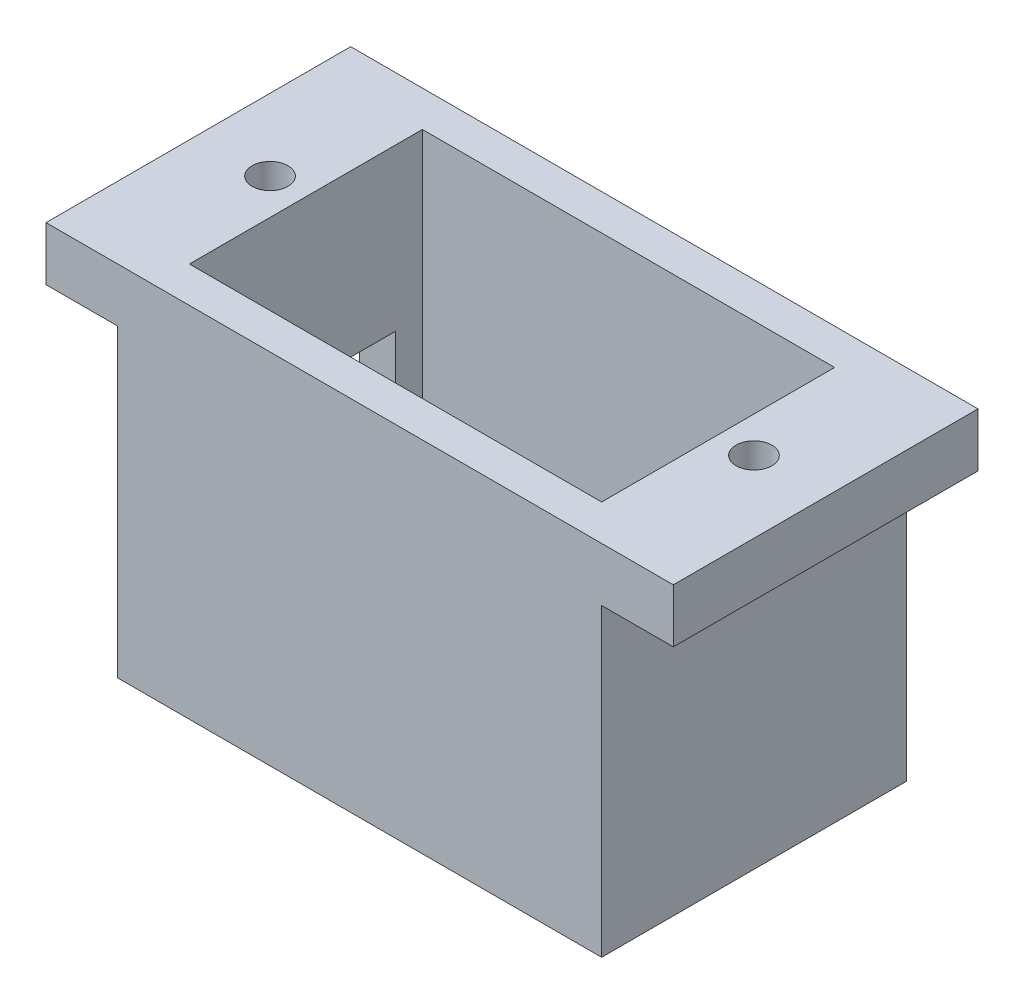
ISO-10303-21;
HEADER;
FILE_DESCRIPTION(('STEP AP214'),'2;1');
FILE_NAME('part.step','',(''),(''),'','','');
FILE_SCHEMA(('AUTOMOTIVE_DESIGN { 1 0 10303 214 1 1 1 1 }'));
ENDSEC;
DATA;
#1=APPLICATION_CONTEXT('core data for automotive mechanical design processes');
#2=APPLICATION_PROTOCOL_DEFINITION('international standard','automotive_design',2000,#1);
#3=PRODUCT_CONTEXT('',#1,'mechanical');
#4=PRODUCT('Part','Part','',(#3));
#5=PRODUCT_RELATED_PRODUCT_CATEGORY('part','',(#4));
#6=PRODUCT_DEFINITION_FORMATION('','',#4);
#7=PRODUCT_DEFINITION_CONTEXT('part definition',#1,'design');
#8=PRODUCT_DEFINITION('design','',#6,#7);
#9=PRODUCT_DEFINITION_SHAPE('','',#8);
#10=(LENGTH_UNIT() NAMED_UNIT(*) SI_UNIT(.MILLI.,.METRE.));
#11=(NAMED_UNIT(*) PLANE_ANGLE_UNIT() SI_UNIT($,.RADIAN.));
#12=(NAMED_UNIT(*) SI_UNIT($,.STERADIAN.) SOLID_ANGLE_UNIT());
#13=UNCERTAINTY_MEASURE_WITH_UNIT(LENGTH_MEASURE(1.E-05),#10,'distance_accuracy_value','');
#14=(GEOMETRIC_REPRESENTATION_CONTEXT(3) GLOBAL_UNCERTAINTY_ASSIGNED_CONTEXT((#13)) GLOBAL_UNIT_ASSIGNED_CONTEXT((#10,
#11,#12)) REPRESENTATION_CONTEXT('',''));
#15=CARTESIAN_POINT('',(0.,0.,0.));
#16=DIRECTION('',(0.,0.,1.));
#17=DIRECTION('',(1.,0.,0.));
#18=AXIS2_PLACEMENT_3D('',#15,#16,#17);
#19=CARTESIAN_POINT('',(0.,18.,0.));
#20=DIRECTION('',(0.,-1.,0.));
#21=DIRECTION('',(0.,0.,-1.));
#22=AXIS2_PLACEMENT_3D('',#19,#20,#21);
#23=PLANE('',#22);
#24=CARTESIAN_POINT('',(-13.5,18.,0.));
#25=DIRECTION('',(0.,1.,0.));
#26=DIRECTION('',(0.,0.,1.));
#27=AXIS2_PLACEMENT_3D('',#24,#25,#26);
#28=CIRCLE('',#27,1.);
#29=CARTESIAN_POINT('',(-13.5,18.,0.999999999999996));
#30=VERTEX_POINT('',#29);
#31=EDGE_CURVE('E177',#30,#30,#28,.T.);
#32=ORIENTED_EDGE('',*,*,#31,.F.);
#33=EDGE_LOOP('',(#32));
#34=FACE_BOUND('',#33,.T.);
#35=CARTESIAN_POINT('',(13.5,18.,0.));
#36=DIRECTION('',(0.,1.,0.));
#37=DIRECTION('',(0.,0.,1.));
#38=AXIS2_PLACEMENT_3D('',#35,#36,#37);
#39=CIRCLE('',#38,1.);
#40=CARTESIAN_POINT('',(13.5,18.,0.999999999999996));
#41=VERTEX_POINT('',#40);
#42=EDGE_CURVE('E187',#41,#41,#39,.T.);
#43=ORIENTED_EDGE('',*,*,#42,.F.);
#44=EDGE_LOOP('',(#43));
#45=FACE_BOUND('',#44,.T.);
#46=DIRECTION('',(-1.,0.,0.));
#47=VECTOR('',#46,1.);
#48=CARTESIAN_POINT('',(-13.5,18.,-8.5));
#49=LINE('',#48,#47);
#50=CARTESIAN_POINT('',(17.5,18.,-8.5));
#51=VERTEX_POINT('',#50);
#52=CARTESIAN_POINT('',(-17.5,18.,-8.5));
#53=VERTEX_POINT('',#52);
#54=EDGE_CURVE('E316',#51,#53,#49,.T.);
#55=ORIENTED_EDGE('',*,*,#54,.T.);
#56=DIRECTION('',(0.,0.,1.));
#57=VECTOR('',#56,1.);
#58=CARTESIAN_POINT('',(-17.5,18.,-8.5));
#59=LINE('',#58,#57);
#60=CARTESIAN_POINT('',(-17.5,18.,8.5));
#61=VERTEX_POINT('',#60);
#62=EDGE_CURVE('E194',#53,#61,#59,.T.);
#63=ORIENTED_EDGE('',*,*,#62,.T.);
#64=DIRECTION('',(1.,0.,0.));
#65=VECTOR('',#64,1.);
#66=CARTESIAN_POINT('',(-13.5,18.,8.5));
#67=LINE('',#66,#65);
#68=CARTESIAN_POINT('',(17.5,18.,8.5));
#69=VERTEX_POINT('',#68);
#70=EDGE_CURVE('E318',#61,#69,#67,.T.);
#71=ORIENTED_EDGE('',*,*,#70,.T.);
#72=DIRECTION('',(0.,0.,-1.));
#73=VECTOR('',#72,1.);
#74=CARTESIAN_POINT('',(17.5,18.,8.5));
#75=LINE('',#74,#73);
#76=EDGE_CURVE('E211',#69,#51,#75,.T.);
#77=ORIENTED_EDGE('',*,*,#76,.T.);
#78=EDGE_LOOP('',(#55,#63,#71,#77));
#79=FACE_BOUND('',#78,.T.);
#80=DIRECTION('',(0.,0.,-1.));
#81=VECTOR('',#80,1.);
#82=CARTESIAN_POINT('',(11.5,18.,-6.5));
#83=LINE('',#82,#81);
#84=CARTESIAN_POINT('',(11.5,18.,6.5));
#85=VERTEX_POINT('',#84);
#86=CARTESIAN_POINT('',(11.5,18.,-6.5));
#87=VERTEX_POINT('',#86);
#88=EDGE_CURVE('E285',#85,#87,#83,.T.);
#89=ORIENTED_EDGE('',*,*,#88,.F.);
#90=DIRECTION('',(1.,0.,0.));
#91=VECTOR('',#90,1.);
#92=CARTESIAN_POINT('',(-11.5,18.,6.5));
#93=LINE('',#92,#91);
#94=CARTESIAN_POINT('',(-11.5,18.,6.5));
#95=VERTEX_POINT('',#94);
#96=EDGE_CURVE('E293',#95,#85,#93,.T.);
#97=ORIENTED_EDGE('',*,*,#96,.F.);
#98=DIRECTION('',(0.,0.,1.));
#99=VECTOR('',#98,1.);
#100=CARTESIAN_POINT('',(-11.5,18.,-6.5));
#101=LINE('',#100,#99);
#102=CARTESIAN_POINT('',(-11.5,18.,-6.5));
#103=VERTEX_POINT('',#102);
#104=EDGE_CURVE('E290',#103,#95,#101,.T.);
#105=ORIENTED_EDGE('',*,*,#104,.F.);
#106=DIRECTION('',(-1.,0.,0.));
#107=VECTOR('',#106,1.);
#108=CARTESIAN_POINT('',(-11.5,18.,-6.5));
#109=LINE('',#108,#107);
#110=EDGE_CURVE('E287',#87,#103,#109,.T.);
#111=ORIENTED_EDGE('',*,*,#110,.F.);
#112=EDGE_LOOP('',(#89,#97,#105,#111));
#113=FACE_BOUND('',#112,.T.);
#114=ADVANCED_FACE('F33',(#34,#45,#79,#113),#23,.F.);
#115=CARTESIAN_POINT('',(-13.5,18.,-8.5));
#116=DIRECTION('',(0.,0.,1.));
#117=DIRECTION('',(1.,0.,0.));
#118=AXIS2_PLACEMENT_3D('',#115,#116,#117);
#119=PLANE('',#118);
#120=ORIENTED_EDGE('',*,*,#54,.F.);
#121=DIRECTION('',(0.,1.,0.));
#122=VECTOR('',#121,1.);
#123=CARTESIAN_POINT('',(17.5,15.,-8.5));
#124=LINE('',#123,#122);
#125=CARTESIAN_POINT('',(17.5,15.,-8.5));
#126=VERTEX_POINT('',#125);
#127=EDGE_CURVE('E229',#126,#51,#124,.T.);
#128=ORIENTED_EDGE('',*,*,#127,.F.);
#129=DIRECTION('',(-1.,0.,0.));
#130=VECTOR('',#129,1.);
#131=CARTESIAN_POINT('',(17.5,15.,-8.5));
#132=LINE('',#131,#130);
#133=CARTESIAN_POINT('',(13.5,15.,-8.5));
#134=VERTEX_POINT('',#133);
#135=EDGE_CURVE('E220',#126,#134,#132,.T.);
#136=ORIENTED_EDGE('',*,*,#135,.T.);
#137=DIRECTION('',(0.,-1.,0.));
#138=VECTOR('',#137,1.);
#139=CARTESIAN_POINT('',(13.5,18.,-8.5));
#140=LINE('',#139,#138);
#141=CARTESIAN_POINT('',(13.5,-2.,-8.5));
#142=VERTEX_POINT('',#141);
#143=EDGE_CURVE('E320',#134,#142,#140,.T.);
#144=ORIENTED_EDGE('',*,*,#143,.T.);
#145=DIRECTION('',(1.,0.,0.));
#146=VECTOR('',#145,1.);
#147=CARTESIAN_POINT('',(0.,-2.,-8.5));
#148=LINE('',#147,#146);
#149=CARTESIAN_POINT('',(-13.5,-2.,-8.5));
#150=VERTEX_POINT('',#149);
#151=EDGE_CURVE('E258',#150,#142,#148,.T.);
#152=ORIENTED_EDGE('',*,*,#151,.F.);
#153=DIRECTION('',(0.,-1.,0.));
#154=VECTOR('',#153,1.);
#155=CARTESIAN_POINT('',(-13.5,18.,-8.5));
#156=LINE('',#155,#154);
#157=CARTESIAN_POINT('',(-13.5,15.,-8.5));
#158=VERTEX_POINT('',#157);
#159=EDGE_CURVE('E326',#158,#150,#156,.T.);
#160=ORIENTED_EDGE('',*,*,#159,.F.);
#161=DIRECTION('',(-1.,0.,0.));
#162=VECTOR('',#161,1.);
#163=CARTESIAN_POINT('',(-13.5,15.,-8.5));
#164=LINE('',#163,#162);
#165=CARTESIAN_POINT('',(-17.5,15.,-8.5));
#166=VERTEX_POINT('',#165);
#167=EDGE_CURVE('E195',#158,#166,#164,.T.);
#168=ORIENTED_EDGE('',*,*,#167,.T.);
#169=DIRECTION('',(0.,1.,0.));
#170=VECTOR('',#169,1.);
#171=CARTESIAN_POINT('',(-17.5,15.,-8.5));
#172=LINE('',#171,#170);
#173=EDGE_CURVE('E205',#166,#53,#172,.T.);
#174=ORIENTED_EDGE('',*,*,#173,.T.);
#175=EDGE_LOOP('',(#120,#128,#136,#144,#152,#160,#168,#174));
#176=FACE_BOUND('',#175,.T.);
#177=ADVANCED_FACE('F35',(#176),#119,.F.);
#178=CARTESIAN_POINT('',(-13.5,18.,-8.5));
#179=DIRECTION('',(1.,0.,0.));
#180=DIRECTION('',(0.,0.,-1.));
#181=AXIS2_PLACEMENT_3D('',#178,#179,#180);
#182=PLANE('',#181);
#183=DIRECTION('',(0.,0.,-1.));
#184=VECTOR('',#183,1.);
#185=CARTESIAN_POINT('',(-13.5,9.,-5.));
#186=LINE('',#185,#184);
#187=CARTESIAN_POINT('',(-13.5,9.,5.));
#188=VERTEX_POINT('',#187);
#189=CARTESIAN_POINT('',(-13.5,9.,-5.));
#190=VERTEX_POINT('',#189);
#191=EDGE_CURVE('E236',#188,#190,#186,.T.);
#192=ORIENTED_EDGE('',*,*,#191,.F.);
#193=DIRECTION('',(0.,1.,0.));
#194=VECTOR('',#193,1.);
#195=CARTESIAN_POINT('',(-13.5,4.,5.));
#196=LINE('',#195,#194);
#197=CARTESIAN_POINT('',(-13.5,4.,5.));
#198=VERTEX_POINT('',#197);
#199=EDGE_CURVE('E232',#198,#188,#196,.T.);
#200=ORIENTED_EDGE('',*,*,#199,.F.);
#201=DIRECTION('',(0.,0.,1.));
#202=VECTOR('',#201,1.);
#203=CARTESIAN_POINT('',(-13.5,4.,-5.));
#204=LINE('',#203,#202);
#205=CARTESIAN_POINT('',(-13.5,4.,-5.));
#206=VERTEX_POINT('',#205);
#207=EDGE_CURVE('E242',#206,#198,#204,.T.);
#208=ORIENTED_EDGE('',*,*,#207,.F.);
#209=DIRECTION('',(0.,-1.,0.));
#210=VECTOR('',#209,1.);
#211=CARTESIAN_POINT('',(-13.5,4.,-5.));
#212=LINE('',#211,#210);
#213=EDGE_CURVE('E239',#190,#206,#212,.T.);
#214=ORIENTED_EDGE('',*,*,#213,.F.);
#215=EDGE_LOOP('',(#192,#200,#208,#214));
#216=FACE_BOUND('',#215,.T.);
#217=DIRECTION('',(0.,0.,1.));
#218=VECTOR('',#217,1.);
#219=CARTESIAN_POINT('',(-13.5,13.,-8.5));
#220=LINE('',#219,#218);
#221=CARTESIAN_POINT('',(-13.5,13.,-1.));
#222=VERTEX_POINT('',#221);
#223=CARTESIAN_POINT('',(-13.5,13.,0.999999999999996));
#224=VERTEX_POINT('',#223);
#225=EDGE_CURVE('E11',#222,#224,#220,.T.);
#226=ORIENTED_EDGE('',*,*,#225,.F.);
#227=DIRECTION('',(0.,1.,0.));
#228=VECTOR('',#227,1.);
#229=CARTESIAN_POINT('',(-13.5,13.,-1.));
#230=LINE('',#229,#228);
#231=CARTESIAN_POINT('',(-13.5,15.,-1.));
#232=VERTEX_POINT('',#231);
#233=EDGE_CURVE('E176',#222,#232,#230,.T.);
#234=ORIENTED_EDGE('',*,*,#233,.T.);
#235=DIRECTION('',(0.,0.,-1.));
#236=VECTOR('',#235,1.);
#237=CARTESIAN_POINT('',(-13.5,15.,-8.5));
#238=LINE('',#237,#236);
#239=EDGE_CURVE('E203',#232,#158,#238,.T.);
#240=ORIENTED_EDGE('',*,*,#239,.T.);
#241=ORIENTED_EDGE('',*,*,#159,.T.);
#242=DIRECTION('',(0.,0.,1.));
#243=VECTOR('',#242,1.);
#244=CARTESIAN_POINT('',(-13.5,-2.,0.));
#245=LINE('',#244,#243);
#246=CARTESIAN_POINT('',(-13.5,-2.,8.5));
#247=VERTEX_POINT('',#246);
#248=EDGE_CURVE('E275',#150,#247,#245,.T.);
#249=ORIENTED_EDGE('',*,*,#248,.T.);
#250=DIRECTION('',(0.,-1.,0.));
#251=VECTOR('',#250,1.);
#252=CARTESIAN_POINT('',(-13.5,18.,8.5));
#253=LINE('',#252,#251);
#254=CARTESIAN_POINT('',(-13.5,15.,8.5));
#255=VERTEX_POINT('',#254);
#256=EDGE_CURVE('E324',#255,#247,#253,.T.);
#257=ORIENTED_EDGE('',*,*,#256,.F.);
#258=CARTESIAN_POINT('',(-13.5,15.,0.999999999999996));
#259=VERTEX_POINT('',#258);
#260=EDGE_CURVE('E183',#255,#259,#238,.T.);
#261=ORIENTED_EDGE('',*,*,#260,.T.);
#262=DIRECTION('',(0.,1.,0.));
#263=VECTOR('',#262,1.);
#264=CARTESIAN_POINT('',(-13.5,13.,0.999999999999996));
#265=LINE('',#264,#263);
#266=EDGE_CURVE('E56',#259,#224,#265,.F.);
#267=ORIENTED_EDGE('',*,*,#266,.T.);
#268=EDGE_LOOP('',(#226,#234,#240,#241,#249,#257,#261,#267));
#269=FACE_BOUND('',#268,.T.);
#270=ADVANCED_FACE('F180',(#216,#269),#182,.F.);
#271=CARTESIAN_POINT('',(-13.5,18.,8.5));
#272=DIRECTION('',(0.,0.,-1.));
#273=DIRECTION('',(-1.,0.,0.));
#274=AXIS2_PLACEMENT_3D('',#271,#272,#273);
#275=PLANE('',#274);
#276=ORIENTED_EDGE('',*,*,#70,.F.);
#277=DIRECTION('',(0.,1.,0.));
#278=VECTOR('',#277,1.);
#279=CARTESIAN_POINT('',(-17.5,15.,8.5));
#280=LINE('',#279,#278);
#281=CARTESIAN_POINT('',(-17.5,15.,8.5));
#282=VERTEX_POINT('',#281);
#283=EDGE_CURVE('E208',#282,#61,#280,.T.);
#284=ORIENTED_EDGE('',*,*,#283,.F.);
#285=DIRECTION('',(1.,0.,0.));
#286=VECTOR('',#285,1.);
#287=CARTESIAN_POINT('',(-17.5,15.,8.5));
#288=LINE('',#287,#286);
#289=EDGE_CURVE('E201',#282,#255,#288,.T.);
#290=ORIENTED_EDGE('',*,*,#289,.T.);
#291=ORIENTED_EDGE('',*,*,#256,.T.);
#292=DIRECTION('',(1.,0.,0.));
#293=VECTOR('',#292,1.);
#294=CARTESIAN_POINT('',(0.,-2.,8.5));
#295=LINE('',#294,#293);
#296=CARTESIAN_POINT('',(13.5,-2.,8.5));
#297=VERTEX_POINT('',#296);
#298=EDGE_CURVE('E278',#247,#297,#295,.T.);
#299=ORIENTED_EDGE('',*,*,#298,.T.);
#300=DIRECTION('',(0.,-1.,0.));
#301=VECTOR('',#300,1.);
#302=CARTESIAN_POINT('',(13.5,18.,8.5));
#303=LINE('',#302,#301);
#304=CARTESIAN_POINT('',(13.5,15.,8.5));
#305=VERTEX_POINT('',#304);
#306=EDGE_CURVE('E322',#305,#297,#303,.T.);
#307=ORIENTED_EDGE('',*,*,#306,.F.);
#308=DIRECTION('',(1.,0.,0.));
#309=VECTOR('',#308,1.);
#310=CARTESIAN_POINT('',(13.5,15.,8.5));
#311=LINE('',#310,#309);
#312=CARTESIAN_POINT('',(17.5,15.,8.5));
#313=VERTEX_POINT('',#312);
#314=EDGE_CURVE('E214',#305,#313,#311,.T.);
#315=ORIENTED_EDGE('',*,*,#314,.T.);
#316=DIRECTION('',(0.,1.,0.));
#317=VECTOR('',#316,1.);
#318=CARTESIAN_POINT('',(17.5,15.,8.5));
#319=LINE('',#318,#317);
#320=EDGE_CURVE('E226',#313,#69,#319,.T.);
#321=ORIENTED_EDGE('',*,*,#320,.T.);
#322=EDGE_LOOP('',(#276,#284,#290,#291,#299,#307,#315,#321));
#323=FACE_BOUND('',#322,.T.);
#324=ADVANCED_FACE('F359',(#323),#275,.F.);
#325=CARTESIAN_POINT('',(13.5,18.,-8.5));
#326=DIRECTION('',(-1.,0.,0.));
#327=DIRECTION('',(0.,0.,1.));
#328=AXIS2_PLACEMENT_3D('',#325,#326,#327);
#329=PLANE('',#328);
#330=DIRECTION('',(0.,0.,-1.));
#331=VECTOR('',#330,1.);
#332=CARTESIAN_POINT('',(13.5,13.,-8.5));
#333=LINE('',#332,#331);
#334=CARTESIAN_POINT('',(13.5,13.,0.999999999999996));
#335=VERTEX_POINT('',#334);
#336=CARTESIAN_POINT('',(13.5,13.,-1.));
#337=VERTEX_POINT('',#336);
#338=EDGE_CURVE('E41',#335,#337,#333,.T.);
#339=ORIENTED_EDGE('',*,*,#338,.F.);
#340=DIRECTION('',(0.,1.,0.));
#341=VECTOR('',#340,1.);
#342=CARTESIAN_POINT('',(13.5,13.,0.999999999999996));
#343=LINE('',#342,#341);
#344=CARTESIAN_POINT('',(13.5,15.,0.999999999999996));
#345=VERTEX_POINT('',#344);
#346=EDGE_CURVE('E191',#335,#345,#343,.T.);
#347=ORIENTED_EDGE('',*,*,#346,.T.);
#348=DIRECTION('',(0.,0.,1.));
#349=VECTOR('',#348,1.);
#350=CARTESIAN_POINT('',(13.5,15.,8.5));
#351=LINE('',#350,#349);
#352=EDGE_CURVE('E222',#345,#305,#351,.T.);
#353=ORIENTED_EDGE('',*,*,#352,.T.);
#354=ORIENTED_EDGE('',*,*,#306,.T.);
#355=DIRECTION('',(0.,0.,1.));
#356=VECTOR('',#355,1.);
#357=CARTESIAN_POINT('',(13.5,-2.,0.));
#358=LINE('',#357,#356);
#359=EDGE_CURVE('E281',#142,#297,#358,.T.);
#360=ORIENTED_EDGE('',*,*,#359,.F.);
#361=ORIENTED_EDGE('',*,*,#143,.F.);
#362=CARTESIAN_POINT('',(13.5,15.,-1.));
#363=VERTEX_POINT('',#362);
#364=EDGE_CURVE('E223',#134,#363,#351,.T.);
#365=ORIENTED_EDGE('',*,*,#364,.T.);
#366=DIRECTION('',(0.,1.,0.));
#367=VECTOR('',#366,1.);
#368=CARTESIAN_POINT('',(13.5,13.,-1.));
#369=LINE('',#368,#367);
#370=EDGE_CURVE('E48',#363,#337,#369,.F.);
#371=ORIENTED_EDGE('',*,*,#370,.T.);
#372=EDGE_LOOP('',(#339,#347,#353,#354,#360,#361,#365,#371));
#373=FACE_BOUND('',#372,.T.);
#374=ADVANCED_FACE('F347',(#373),#329,.F.);
#375=CARTESIAN_POINT('',(11.5,18.,-6.5));
#376=DIRECTION('',(-1.,0.,0.));
#377=DIRECTION('',(0.,0.,1.));
#378=AXIS2_PLACEMENT_3D('',#375,#376,#377);
#379=PLANE('',#378);
#380=DIRECTION('',(0.,0.,-1.));
#381=VECTOR('',#380,1.);
#382=CARTESIAN_POINT('',(11.5,0.,-6.5));
#383=LINE('',#382,#381);
#384=CARTESIAN_POINT('',(11.5,0.,6.5));
#385=VERTEX_POINT('',#384);
#386=CARTESIAN_POINT('',(11.5,0.,-6.5));
#387=VERTEX_POINT('',#386);
#388=EDGE_CURVE('E284',#385,#387,#383,.T.);
#389=ORIENTED_EDGE('',*,*,#388,.F.);
#390=DIRECTION('',(0.,-1.,0.));
#391=VECTOR('',#390,1.);
#392=CARTESIAN_POINT('',(11.5,18.,6.5));
#393=LINE('',#392,#391);
#394=EDGE_CURVE('E295',#85,#385,#393,.T.);
#395=ORIENTED_EDGE('',*,*,#394,.F.);
#396=ORIENTED_EDGE('',*,*,#88,.T.);
#397=DIRECTION('',(0.,-1.,0.));
#398=VECTOR('',#397,1.);
#399=CARTESIAN_POINT('',(11.5,18.,-6.5));
#400=LINE('',#399,#398);
#401=EDGE_CURVE('E313',#87,#387,#400,.T.);
#402=ORIENTED_EDGE('',*,*,#401,.T.);
#403=EDGE_LOOP('',(#389,#395,#396,#402));
#404=FACE_BOUND('',#403,.T.);
#405=ADVANCED_FACE('F401',(#404),#379,.T.);
#406=CARTESIAN_POINT('',(-11.5,18.,-6.5));
#407=DIRECTION('',(0.,0.,1.));
#408=DIRECTION('',(1.,0.,0.));
#409=AXIS2_PLACEMENT_3D('',#406,#407,#408);
#410=PLANE('',#409);
#411=DIRECTION('',(-1.,0.,0.));
#412=VECTOR('',#411,1.);
#413=CARTESIAN_POINT('',(-11.5,0.,-6.5));
#414=LINE('',#413,#412);
#415=CARTESIAN_POINT('',(-11.5,0.,-6.5));
#416=VERTEX_POINT('',#415);
#417=EDGE_CURVE('E298',#387,#416,#414,.T.);
#418=ORIENTED_EDGE('',*,*,#417,.F.);
#419=ORIENTED_EDGE('',*,*,#401,.F.);
#420=ORIENTED_EDGE('',*,*,#110,.T.);
#421=DIRECTION('',(0.,-1.,0.));
#422=VECTOR('',#421,1.);
#423=CARTESIAN_POINT('',(-11.5,18.,-6.5));
#424=LINE('',#423,#422);
#425=EDGE_CURVE('E311',#103,#416,#424,.T.);
#426=ORIENTED_EDGE('',*,*,#425,.T.);
#427=EDGE_LOOP('',(#418,#419,#420,#426));
#428=FACE_BOUND('',#427,.T.);
#429=ADVANCED_FACE('F467',(#428),#410,.T.);
#430=CARTESIAN_POINT('',(-11.5,18.,-6.5));
#431=DIRECTION('',(1.,0.,0.));
#432=DIRECTION('',(0.,0.,-1.));
#433=AXIS2_PLACEMENT_3D('',#430,#431,#432);
#434=PLANE('',#433);
#435=DIRECTION('',(0.,-1.,0.));
#436=VECTOR('',#435,1.);
#437=CARTESIAN_POINT('',(-11.5,18.,5.));
#438=LINE('',#437,#436);
#439=CARTESIAN_POINT('',(-11.5,9.,5.));
#440=VERTEX_POINT('',#439);
#441=CARTESIAN_POINT('',(-11.5,4.,5.));
#442=VERTEX_POINT('',#441);
#443=EDGE_CURVE('E335',#440,#442,#438,.T.);
#444=ORIENTED_EDGE('',*,*,#443,.F.);
#445=DIRECTION('',(0.,0.,1.));
#446=VECTOR('',#445,1.);
#447=CARTESIAN_POINT('',(-11.5,9.,-6.5));
#448=LINE('',#447,#446);
#449=CARTESIAN_POINT('',(-11.5,9.,-5.));
#450=VERTEX_POINT('',#449);
#451=EDGE_CURVE('E328',#450,#440,#448,.T.);
#452=ORIENTED_EDGE('',*,*,#451,.F.);
#453=DIRECTION('',(0.,1.,0.));
#454=VECTOR('',#453,1.);
#455=CARTESIAN_POINT('',(-11.5,18.,-5.));
#456=LINE('',#455,#454);
#457=CARTESIAN_POINT('',(-11.5,4.,-5.));
#458=VERTEX_POINT('',#457);
#459=EDGE_CURVE('E330',#458,#450,#456,.T.);
#460=ORIENTED_EDGE('',*,*,#459,.F.);
#461=DIRECTION('',(0.,0.,-1.));
#462=VECTOR('',#461,1.);
#463=CARTESIAN_POINT('',(-11.5,4.,-6.5));
#464=LINE('',#463,#462);
#465=EDGE_CURVE('E333',#442,#458,#464,.T.);
#466=ORIENTED_EDGE('',*,*,#465,.F.);
#467=EDGE_LOOP('',(#444,#452,#460,#466));
#468=FACE_BOUND('',#467,.T.);
#469=DIRECTION('',(0.,0.,1.));
#470=VECTOR('',#469,1.);
#471=CARTESIAN_POINT('',(-11.5,0.,-6.5));
#472=LINE('',#471,#470);
#473=CARTESIAN_POINT('',(-11.5,0.,6.5));
#474=VERTEX_POINT('',#473);
#475=EDGE_CURVE('E301',#416,#474,#472,.T.);
#476=ORIENTED_EDGE('',*,*,#475,.F.);
#477=ORIENTED_EDGE('',*,*,#425,.F.);
#478=ORIENTED_EDGE('',*,*,#104,.T.);
#479=DIRECTION('',(0.,-1.,0.));
#480=VECTOR('',#479,1.);
#481=CARTESIAN_POINT('',(-11.5,18.,6.5));
#482=LINE('',#481,#480);
#483=EDGE_CURVE('E308',#95,#474,#482,.T.);
#484=ORIENTED_EDGE('',*,*,#483,.T.);
#485=EDGE_LOOP('',(#476,#477,#478,#484));
#486=FACE_BOUND('',#485,.T.);
#487=ADVANCED_FACE('F424',(#468,#486),#434,.T.);
#488=CARTESIAN_POINT('',(-11.5,18.,6.5));
#489=DIRECTION('',(0.,0.,-1.));
#490=DIRECTION('',(-1.,0.,0.));
#491=AXIS2_PLACEMENT_3D('',#488,#489,#490);
#492=PLANE('',#491);
#493=DIRECTION('',(1.,0.,0.));
#494=VECTOR('',#493,1.);
#495=CARTESIAN_POINT('',(-11.5,0.,6.5));
#496=LINE('',#495,#494);
#497=EDGE_CURVE('E288',#474,#385,#496,.T.);
#498=ORIENTED_EDGE('',*,*,#497,.F.);
#499=ORIENTED_EDGE('',*,*,#483,.F.);
#500=ORIENTED_EDGE('',*,*,#96,.T.);
#501=ORIENTED_EDGE('',*,*,#394,.T.);
#502=EDGE_LOOP('',(#498,#499,#500,#501));
#503=FACE_BOUND('',#502,.T.);
#504=ADVANCED_FACE('F461',(#503),#492,.T.);
#505=CARTESIAN_POINT('',(0.,0.,0.));
#506=DIRECTION('',(0.,1.,0.));
#507=DIRECTION('',(0.,0.,1.));
#508=AXIS2_PLACEMENT_3D('',#505,#506,#507);
#509=PLANE('',#508);
#510=CARTESIAN_POINT('',(-6.,0.,0.));
#511=DIRECTION('',(0.,1.,0.));
#512=DIRECTION('',(0.,0.,1.));
#513=AXIS2_PLACEMENT_3D('',#510,#511,#512);
#514=CIRCLE('',#513,1.5);
#515=CARTESIAN_POINT('',(-6.,0.,1.5));
#516=VERTEX_POINT('',#515);
#517=EDGE_CURVE('E259',#516,#516,#514,.T.);
#518=ORIENTED_EDGE('',*,*,#517,.F.);
#519=EDGE_LOOP('',(#518));
#520=FACE_BOUND('',#519,.T.);
#521=CARTESIAN_POINT('',(0.,0.,0.));
#522=DIRECTION('',(0.,1.,0.));
#523=DIRECTION('',(0.,0.,1.));
#524=AXIS2_PLACEMENT_3D('',#521,#522,#523);
#525=CIRCLE('',#524,1.5);
#526=CARTESIAN_POINT('',(0.,0.,1.5));
#527=VERTEX_POINT('',#526);
#528=EDGE_CURVE('E265',#527,#527,#525,.T.);
#529=ORIENTED_EDGE('',*,*,#528,.F.);
#530=EDGE_LOOP('',(#529));
#531=FACE_BOUND('',#530,.T.);
#532=CARTESIAN_POINT('',(6.,0.,0.));
#533=DIRECTION('',(0.,1.,0.));
#534=DIRECTION('',(0.,0.,1.));
#535=AXIS2_PLACEMENT_3D('',#532,#533,#534);
#536=CIRCLE('',#535,1.5);
#537=CARTESIAN_POINT('',(6.,0.,1.5));
#538=VERTEX_POINT('',#537);
#539=EDGE_CURVE('E248',#538,#538,#536,.T.);
#540=ORIENTED_EDGE('',*,*,#539,.F.);
#541=EDGE_LOOP('',(#540));
#542=FACE_BOUND('',#541,.T.);
#543=ORIENTED_EDGE('',*,*,#475,.T.);
#544=ORIENTED_EDGE('',*,*,#497,.T.);
#545=ORIENTED_EDGE('',*,*,#388,.T.);
#546=ORIENTED_EDGE('',*,*,#417,.T.);
#547=EDGE_LOOP('',(#543,#544,#545,#546));
#548=FACE_BOUND('',#547,.T.);
#549=ADVANCED_FACE('F457',(#520,#531,#542,#548),#509,.T.);
#550=CARTESIAN_POINT('',(0.,-2.,0.));
#551=DIRECTION('',(0.,1.,0.));
#552=DIRECTION('',(0.,0.,1.));
#553=AXIS2_PLACEMENT_3D('',#550,#551,#552);
#554=PLANE('',#553);
#555=CARTESIAN_POINT('',(-6.,-2.,0.));
#556=DIRECTION('',(0.,1.,0.));
#557=DIRECTION('',(0.,0.,1.));
#558=AXIS2_PLACEMENT_3D('',#555,#556,#557);
#559=CIRCLE('',#558,1.5);
#560=CARTESIAN_POINT('',(-6.,-2.,1.5));
#561=VERTEX_POINT('',#560);
#562=EDGE_CURVE('E255',#561,#561,#559,.T.);
#563=ORIENTED_EDGE('',*,*,#562,.T.);
#564=EDGE_LOOP('',(#563));
#565=FACE_BOUND('',#564,.T.);
#566=CARTESIAN_POINT('',(0.,-2.,0.));
#567=DIRECTION('',(0.,1.,0.));
#568=DIRECTION('',(0.,0.,1.));
#569=AXIS2_PLACEMENT_3D('',#566,#567,#568);
#570=CIRCLE('',#569,1.5);
#571=CARTESIAN_POINT('',(0.,-2.,1.5));
#572=VERTEX_POINT('',#571);
#573=EDGE_CURVE('E262',#572,#572,#570,.T.);
#574=ORIENTED_EDGE('',*,*,#573,.T.);
#575=EDGE_LOOP('',(#574));
#576=FACE_BOUND('',#575,.T.);
#577=CARTESIAN_POINT('',(6.,-2.,0.));
#578=DIRECTION('',(0.,1.,0.));
#579=DIRECTION('',(0.,0.,1.));
#580=AXIS2_PLACEMENT_3D('',#577,#578,#579);
#581=CIRCLE('',#580,1.5);
#582=CARTESIAN_POINT('',(6.,-2.,1.5));
#583=VERTEX_POINT('',#582);
#584=EDGE_CURVE('E268',#583,#583,#581,.T.);
#585=ORIENTED_EDGE('',*,*,#584,.T.);
#586=EDGE_LOOP('',(#585));
#587=FACE_BOUND('',#586,.T.);
#588=ORIENTED_EDGE('',*,*,#151,.T.);
#589=ORIENTED_EDGE('',*,*,#359,.T.);
#590=ORIENTED_EDGE('',*,*,#298,.F.);
#591=ORIENTED_EDGE('',*,*,#248,.F.);
#592=EDGE_LOOP('',(#588,#589,#590,#591));
#593=FACE_BOUND('',#592,.T.);
#594=ADVANCED_FACE('F363',(#565,#576,#587,#593),#554,.F.);
#595=CARTESIAN_POINT('',(6.,-2.,0.));
#596=DIRECTION('',(0.,1.,0.));
#597=DIRECTION('',(0.,0.,1.));
#598=AXIS2_PLACEMENT_3D('',#595,#596,#597);
#599=CYLINDRICAL_SURFACE('',#598,1.5);
#600=ORIENTED_EDGE('',*,*,#584,.F.);
#601=EDGE_LOOP('',(#600));
#602=FACE_BOUND('',#601,.T.);
#603=ORIENTED_EDGE('',*,*,#539,.T.);
#604=EDGE_LOOP('',(#603));
#605=FACE_BOUND('',#604,.T.);
#606=ADVANCED_FACE('F450',(#602,#605),#599,.F.);
#607=CARTESIAN_POINT('',(0.,-2.,0.));
#608=DIRECTION('',(0.,1.,0.));
#609=DIRECTION('',(0.,0.,1.));
#610=AXIS2_PLACEMENT_3D('',#607,#608,#609);
#611=CYLINDRICAL_SURFACE('',#610,1.5);
#612=ORIENTED_EDGE('',*,*,#573,.F.);
#613=EDGE_LOOP('',(#612));
#614=FACE_BOUND('',#613,.T.);
#615=ORIENTED_EDGE('',*,*,#528,.T.);
#616=EDGE_LOOP('',(#615));
#617=FACE_BOUND('',#616,.T.);
#618=ADVANCED_FACE('F446',(#614,#617),#611,.F.);
#619=CARTESIAN_POINT('',(-6.,-2.,0.));
#620=DIRECTION('',(0.,1.,0.));
#621=DIRECTION('',(0.,0.,1.));
#622=AXIS2_PLACEMENT_3D('',#619,#620,#621);
#623=CYLINDRICAL_SURFACE('',#622,1.5);
#624=ORIENTED_EDGE('',*,*,#562,.F.);
#625=EDGE_LOOP('',(#624));
#626=FACE_BOUND('',#625,.T.);
#627=ORIENTED_EDGE('',*,*,#517,.T.);
#628=EDGE_LOOP('',(#627));
#629=FACE_BOUND('',#628,.T.);
#630=ADVANCED_FACE('F444',(#626,#629),#623,.F.);
#631=CARTESIAN_POINT('',(-10.5,4.,5.));
#632=DIRECTION('',(0.,0.,1.));
#633=DIRECTION('',(1.,0.,0.));
#634=AXIS2_PLACEMENT_3D('',#631,#632,#633);
#635=PLANE('',#634);
#636=ORIENTED_EDGE('',*,*,#443,.T.);
#637=DIRECTION('',(-1.,0.,0.));
#638=VECTOR('',#637,1.);
#639=CARTESIAN_POINT('',(-10.5,4.,5.));
#640=LINE('',#639,#638);
#641=EDGE_CURVE('E246',#442,#198,#640,.T.);
#642=ORIENTED_EDGE('',*,*,#641,.T.);
#643=ORIENTED_EDGE('',*,*,#199,.T.);
#644=DIRECTION('',(-1.,0.,0.));
#645=VECTOR('',#644,1.);
#646=CARTESIAN_POINT('',(-10.5,9.,5.));
#647=LINE('',#646,#645);
#648=EDGE_CURVE('E245',#440,#188,#647,.T.);
#649=ORIENTED_EDGE('',*,*,#648,.F.);
#650=EDGE_LOOP('',(#636,#642,#643,#649));
#651=FACE_BOUND('',#650,.T.);
#652=ADVANCED_FACE('F420',(#651),#635,.F.);
#653=CARTESIAN_POINT('',(-10.5,4.,-5.));
#654=DIRECTION('',(0.,-1.,0.));
#655=DIRECTION('',(0.,0.,-1.));
#656=AXIS2_PLACEMENT_3D('',#653,#654,#655);
#657=PLANE('',#656);
#658=ORIENTED_EDGE('',*,*,#465,.T.);
#659=DIRECTION('',(-1.,0.,0.));
#660=VECTOR('',#659,1.);
#661=CARTESIAN_POINT('',(-10.5,4.,-5.));
#662=LINE('',#661,#660);
#663=EDGE_CURVE('E249',#458,#206,#662,.T.);
#664=ORIENTED_EDGE('',*,*,#663,.T.);
#665=ORIENTED_EDGE('',*,*,#207,.T.);
#666=ORIENTED_EDGE('',*,*,#641,.F.);
#667=EDGE_LOOP('',(#658,#664,#665,#666));
#668=FACE_BOUND('',#667,.T.);
#669=ADVANCED_FACE('F429',(#668),#657,.F.);
#670=CARTESIAN_POINT('',(-10.5,4.,-5.));
#671=DIRECTION('',(0.,0.,-1.));
#672=DIRECTION('',(-1.,0.,0.));
#673=AXIS2_PLACEMENT_3D('',#670,#671,#672);
#674=PLANE('',#673);
#675=ORIENTED_EDGE('',*,*,#459,.T.);
#676=DIRECTION('',(-1.,0.,0.));
#677=VECTOR('',#676,1.);
#678=CARTESIAN_POINT('',(-10.5,9.,-5.));
#679=LINE('',#678,#677);
#680=EDGE_CURVE('E251',#450,#190,#679,.T.);
#681=ORIENTED_EDGE('',*,*,#680,.T.);
#682=ORIENTED_EDGE('',*,*,#213,.T.);
#683=ORIENTED_EDGE('',*,*,#663,.F.);
#684=EDGE_LOOP('',(#675,#681,#682,#683));
#685=FACE_BOUND('',#684,.T.);
#686=ADVANCED_FACE('F431',(#685),#674,.F.);
#687=CARTESIAN_POINT('',(-10.5,9.,-5.));
#688=DIRECTION('',(0.,1.,0.));
#689=DIRECTION('',(0.,0.,1.));
#690=AXIS2_PLACEMENT_3D('',#687,#688,#689);
#691=PLANE('',#690);
#692=ORIENTED_EDGE('',*,*,#451,.T.);
#693=ORIENTED_EDGE('',*,*,#648,.T.);
#694=ORIENTED_EDGE('',*,*,#191,.T.);
#695=ORIENTED_EDGE('',*,*,#680,.F.);
#696=EDGE_LOOP('',(#692,#693,#694,#695));
#697=FACE_BOUND('',#696,.T.);
#698=ADVANCED_FACE('F415',(#697),#691,.F.);
#699=CARTESIAN_POINT('',(17.5,15.,8.5));
#700=DIRECTION('',(1.,0.,0.));
#701=DIRECTION('',(0.,0.,-1.));
#702=AXIS2_PLACEMENT_3D('',#699,#700,#701);
#703=PLANE('',#702);
#704=ORIENTED_EDGE('',*,*,#76,.F.);
#705=ORIENTED_EDGE('',*,*,#320,.F.);
#706=DIRECTION('',(0.,0.,-1.));
#707=VECTOR('',#706,1.);
#708=CARTESIAN_POINT('',(17.5,15.,8.5));
#709=LINE('',#708,#707);
#710=EDGE_CURVE('E217',#313,#126,#709,.T.);
#711=ORIENTED_EDGE('',*,*,#710,.T.);
#712=ORIENTED_EDGE('',*,*,#127,.T.);
#713=EDGE_LOOP('',(#704,#705,#711,#712));
#714=FACE_BOUND('',#713,.T.);
#715=ADVANCED_FACE('F371',(#714),#703,.T.);
#716=CARTESIAN_POINT('',(0.,15.,0.));
#717=DIRECTION('',(0.,1.,0.));
#718=DIRECTION('',(0.,0.,1.));
#719=AXIS2_PLACEMENT_3D('',#716,#717,#718);
#720=PLANE('',#719);
#721=ORIENTED_EDGE('',*,*,#352,.F.);
#722=CARTESIAN_POINT('',(13.5,15.,0.));
#723=DIRECTION('',(0.,1.,0.));
#724=DIRECTION('',(0.,0.,1.));
#725=AXIS2_PLACEMENT_3D('',#722,#723,#724);
#726=CIRCLE('',#725,1.);
#727=EDGE_CURVE('E339',#345,#363,#726,.T.);
#728=ORIENTED_EDGE('',*,*,#727,.T.);
#729=ORIENTED_EDGE('',*,*,#364,.F.);
#730=ORIENTED_EDGE('',*,*,#135,.F.);
#731=ORIENTED_EDGE('',*,*,#710,.F.);
#732=ORIENTED_EDGE('',*,*,#314,.F.);
#733=EDGE_LOOP('',(#721,#728,#729,#730,#731,#732));
#734=FACE_BOUND('',#733,.T.);
#735=ADVANCED_FACE('F354',(#734),#720,.F.);
#736=CARTESIAN_POINT('',(-17.5,15.,-8.5));
#737=DIRECTION('',(-1.,0.,0.));
#738=DIRECTION('',(0.,0.,1.));
#739=AXIS2_PLACEMENT_3D('',#736,#737,#738);
#740=PLANE('',#739);
#741=ORIENTED_EDGE('',*,*,#62,.F.);
#742=ORIENTED_EDGE('',*,*,#173,.F.);
#743=DIRECTION('',(0.,0.,1.));
#744=VECTOR('',#743,1.);
#745=CARTESIAN_POINT('',(-17.5,15.,-8.5));
#746=LINE('',#745,#744);
#747=EDGE_CURVE('E198',#166,#282,#746,.T.);
#748=ORIENTED_EDGE('',*,*,#747,.T.);
#749=ORIENTED_EDGE('',*,*,#283,.T.);
#750=EDGE_LOOP('',(#741,#742,#748,#749));
#751=FACE_BOUND('',#750,.T.);
#752=ADVANCED_FACE('F377',(#751),#740,.T.);
#753=CARTESIAN_POINT('',(0.,15.,0.));
#754=DIRECTION('',(0.,1.,0.));
#755=DIRECTION('',(0.,0.,1.));
#756=AXIS2_PLACEMENT_3D('',#753,#754,#755);
#757=PLANE('',#756);
#758=ORIENTED_EDGE('',*,*,#239,.F.);
#759=CARTESIAN_POINT('',(-13.5,15.,0.));
#760=DIRECTION('',(0.,1.,0.));
#761=DIRECTION('',(0.,0.,1.));
#762=AXIS2_PLACEMENT_3D('',#759,#760,#761);
#763=CIRCLE('',#762,1.);
#764=EDGE_CURVE('E337',#232,#259,#763,.T.);
#765=ORIENTED_EDGE('',*,*,#764,.T.);
#766=ORIENTED_EDGE('',*,*,#260,.F.);
#767=ORIENTED_EDGE('',*,*,#289,.F.);
#768=ORIENTED_EDGE('',*,*,#747,.F.);
#769=ORIENTED_EDGE('',*,*,#167,.F.);
#770=EDGE_LOOP('',(#758,#765,#766,#767,#768,#769));
#771=FACE_BOUND('',#770,.T.);
#772=ADVANCED_FACE('F380',(#771),#757,.F.);
#773=CARTESIAN_POINT('',(-13.5,13.,0.));
#774=DIRECTION('',(0.,1.,0.));
#775=DIRECTION('',(0.,0.,1.));
#776=AXIS2_PLACEMENT_3D('',#773,#774,#775);
#777=PLANE('',#776);
#778=ORIENTED_EDGE('',*,*,#225,.T.);
#779=CARTESIAN_POINT('',(-13.5,13.,0.));
#780=DIRECTION('',(0.,1.,0.));
#781=DIRECTION('',(0.,0.,1.));
#782=AXIS2_PLACEMENT_3D('',#779,#780,#781);
#783=CIRCLE('',#782,1.);
#784=EDGE_CURVE('E172',#224,#222,#783,.T.);
#785=ORIENTED_EDGE('',*,*,#784,.T.);
#786=EDGE_LOOP('',(#778,#785));
#787=FACE_BOUND('',#786,.T.);
#788=ADVANCED_FACE('F171',(#787),#777,.T.);
#789=CARTESIAN_POINT('',(-13.5,13.,0.));
#790=DIRECTION('',(0.,1.,0.));
#791=DIRECTION('',(0.,0.,1.));
#792=AXIS2_PLACEMENT_3D('',#789,#790,#791);
#793=CYLINDRICAL_SURFACE('',#792,1.);
#794=ORIENTED_EDGE('',*,*,#31,.T.);
#795=EDGE_LOOP('',(#794));
#796=FACE_BOUND('',#795,.T.);
#797=ORIENTED_EDGE('',*,*,#784,.F.);
#798=ORIENTED_EDGE('',*,*,#266,.F.);
#799=ORIENTED_EDGE('',*,*,#764,.F.);
#800=ORIENTED_EDGE('',*,*,#233,.F.);
#801=EDGE_LOOP('',(#797,#798,#799,#800));
#802=FACE_BOUND('',#801,.T.);
#803=ADVANCED_FACE('F175',(#796,#802),#793,.F.);
#804=CARTESIAN_POINT('',(13.5,13.,0.));
#805=DIRECTION('',(0.,1.,0.));
#806=DIRECTION('',(0.,0.,1.));
#807=AXIS2_PLACEMENT_3D('',#804,#805,#806);
#808=PLANE('',#807);
#809=ORIENTED_EDGE('',*,*,#338,.T.);
#810=CARTESIAN_POINT('',(13.5,13.,0.));
#811=DIRECTION('',(0.,1.,0.));
#812=DIRECTION('',(0.,0.,1.));
#813=AXIS2_PLACEMENT_3D('',#810,#811,#812);
#814=CIRCLE('',#813,1.);
#815=EDGE_CURVE('E344',#337,#335,#814,.T.);
#816=ORIENTED_EDGE('',*,*,#815,.T.);
#817=EDGE_LOOP('',(#809,#816));
#818=FACE_BOUND('',#817,.T.);
#819=ADVANCED_FACE('F343',(#818),#808,.T.);
#820=CARTESIAN_POINT('',(13.5,13.,0.));
#821=DIRECTION('',(0.,1.,0.));
#822=DIRECTION('',(0.,0.,1.));
#823=AXIS2_PLACEMENT_3D('',#820,#821,#822);
#824=CYLINDRICAL_SURFACE('',#823,1.);
#825=ORIENTED_EDGE('',*,*,#42,.T.);
#826=EDGE_LOOP('',(#825));
#827=FACE_BOUND('',#826,.T.);
#828=ORIENTED_EDGE('',*,*,#815,.F.);
#829=ORIENTED_EDGE('',*,*,#370,.F.);
#830=ORIENTED_EDGE('',*,*,#727,.F.);
#831=ORIENTED_EDGE('',*,*,#346,.F.);
#832=EDGE_LOOP('',(#828,#829,#830,#831));
#833=FACE_BOUND('',#832,.T.);
#834=ADVANCED_FACE('F346',(#827,#833),#824,.F.);
#835=CLOSED_SHELL('',(#114,#177,#270,#324,#374,#405,#429,#487,#504,#549,#594,#606,#618,#630,
#652,#669,#686,#698,#715,#735,#752,#772,#788,#803,#819,#834));
#836=MANIFOLD_SOLID_BREP('B2',#835);
#837=ADVANCED_BREP_SHAPE_REPRESENTATION('',(#18,#836),#14);
#838=SHAPE_DEFINITION_REPRESENTATION(#9,#837);
ENDSEC;
END-ISO-10303-21;
